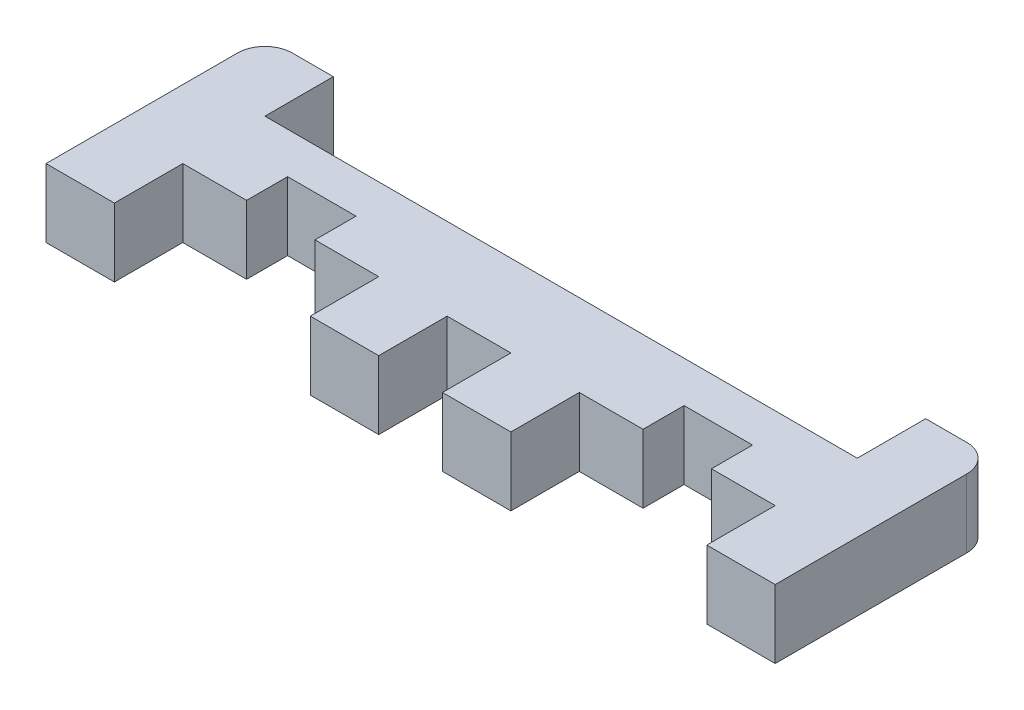
ISO-10303-21;
HEADER;
FILE_DESCRIPTION(('STEP AP214'),'2;1');
FILE_NAME('part.step','',(''),(''),'','','');
FILE_SCHEMA(('AUTOMOTIVE_DESIGN { 1 0 10303 214 1 1 1 1 }'));
ENDSEC;
DATA;
#1=APPLICATION_CONTEXT('core data for automotive mechanical design processes');
#2=APPLICATION_PROTOCOL_DEFINITION('international standard','automotive_design',2000,#1);
#3=PRODUCT_CONTEXT('',#1,'mechanical');
#4=PRODUCT('Part','Part','',(#3));
#5=PRODUCT_RELATED_PRODUCT_CATEGORY('part','',(#4));
#6=PRODUCT_DEFINITION_FORMATION('','',#4);
#7=PRODUCT_DEFINITION_CONTEXT('part definition',#1,'design');
#8=PRODUCT_DEFINITION('design','',#6,#7);
#9=PRODUCT_DEFINITION_SHAPE('','',#8);
#10=(LENGTH_UNIT() NAMED_UNIT(*) SI_UNIT(.MILLI.,.METRE.));
#11=(NAMED_UNIT(*) PLANE_ANGLE_UNIT() SI_UNIT($,.RADIAN.));
#12=(NAMED_UNIT(*) SI_UNIT($,.STERADIAN.) SOLID_ANGLE_UNIT());
#13=UNCERTAINTY_MEASURE_WITH_UNIT(LENGTH_MEASURE(1.E-05),#10,'distance_accuracy_value','');
#14=(GEOMETRIC_REPRESENTATION_CONTEXT(3) GLOBAL_UNCERTAINTY_ASSIGNED_CONTEXT((#13)) GLOBAL_UNIT_ASSIGNED_CONTEXT((#10,
#11,#12)) REPRESENTATION_CONTEXT('',''));
#15=CARTESIAN_POINT('',(0.,0.,0.));
#16=DIRECTION('',(0.,0.,1.));
#17=DIRECTION('',(1.,0.,0.));
#18=AXIS2_PLACEMENT_3D('',#15,#16,#17);
#19=CARTESIAN_POINT('',(-31.3055,6.35,-3.81));
#20=DIRECTION('',(0.,-1.,0.));
#21=DIRECTION('',(0.,0.,-1.));
#22=AXIS2_PLACEMENT_3D('',#19,#20,#21);
#23=CYLINDRICAL_SURFACE('',#22,2.54);
#24=CARTESIAN_POINT('',(-31.3055,0.,-3.81));
#25=DIRECTION('',(0.,1.,0.));
#26=DIRECTION('',(0.,0.,-1.));
#27=AXIS2_PLACEMENT_3D('',#24,#25,#26);
#28=CIRCLE('',#27,2.54);
#29=CARTESIAN_POINT('',(-31.3055,0.,-6.35));
#30=VERTEX_POINT('',#29);
#31=CARTESIAN_POINT('',(-33.8455,0.,-3.80999999999998));
#32=VERTEX_POINT('',#31);
#33=EDGE_CURVE('E264',#30,#32,#28,.T.);
#34=ORIENTED_EDGE('',*,*,#33,.T.);
#35=DIRECTION('',(0.,-1.,0.));
#36=VECTOR('',#35,1.);
#37=CARTESIAN_POINT('',(-33.8455,6.35,-3.80999999999998));
#38=LINE('',#37,#36);
#39=CARTESIAN_POINT('',(-33.8455,6.35,-3.80999999999998));
#40=VERTEX_POINT('',#39);
#41=EDGE_CURVE('E11',#40,#32,#38,.T.);
#42=ORIENTED_EDGE('',*,*,#41,.F.);
#43=CARTESIAN_POINT('',(-31.3055,6.35,-3.81));
#44=DIRECTION('',(0.,1.,0.));
#45=DIRECTION('',(0.,0.,-1.));
#46=AXIS2_PLACEMENT_3D('',#43,#44,#45);
#47=CIRCLE('',#46,2.54);
#48=CARTESIAN_POINT('',(-31.3055,6.35,-6.35));
#49=VERTEX_POINT('',#48);
#50=EDGE_CURVE('E323',#49,#40,#47,.T.);
#51=ORIENTED_EDGE('',*,*,#50,.F.);
#52=DIRECTION('',(0.,-1.,0.));
#53=VECTOR('',#52,1.);
#54=CARTESIAN_POINT('',(-31.3055,6.35,-6.35));
#55=LINE('',#54,#53);
#56=EDGE_CURVE('E260',#49,#30,#55,.T.);
#57=ORIENTED_EDGE('',*,*,#56,.T.);
#58=EDGE_LOOP('',(#34,#42,#51,#57));
#59=FACE_BOUND('',#58,.T.);
#60=ADVANCED_FACE('F37',(#59),#23,.T.);
#61=CARTESIAN_POINT('',(-33.8455,6.35,7.62));
#62=DIRECTION('',(1.,0.,0.));
#63=DIRECTION('',(0.,0.,-1.));
#64=AXIS2_PLACEMENT_3D('',#61,#62,#63);
#65=PLANE('',#64);
#66=DIRECTION('',(0.,0.,1.));
#67=VECTOR('',#66,1.);
#68=CARTESIAN_POINT('',(-33.8455,0.,7.62));
#69=LINE('',#68,#67);
#70=CARTESIAN_POINT('',(-33.8455,0.,13.97));
#71=VERTEX_POINT('',#70);
#72=EDGE_CURVE('E267',#32,#71,#69,.T.);
#73=ORIENTED_EDGE('',*,*,#72,.T.);
#74=DIRECTION('',(0.,-1.,0.));
#75=VECTOR('',#74,1.);
#76=CARTESIAN_POINT('',(-33.8455,6.35,13.97));
#77=LINE('',#76,#75);
#78=CARTESIAN_POINT('',(-33.8455,6.35,13.97));
#79=VERTEX_POINT('',#78);
#80=EDGE_CURVE('E45',#79,#71,#77,.T.);
#81=ORIENTED_EDGE('',*,*,#80,.F.);
#82=DIRECTION('',(0.,0.,1.));
#83=VECTOR('',#82,1.);
#84=CARTESIAN_POINT('',(-33.8455,6.35,7.62));
#85=LINE('',#84,#83);
#86=EDGE_CURVE('E162',#40,#79,#85,.T.);
#87=ORIENTED_EDGE('',*,*,#86,.F.);
#88=ORIENTED_EDGE('',*,*,#41,.T.);
#89=EDGE_LOOP('',(#73,#81,#87,#88));
#90=FACE_BOUND('',#89,.T.);
#91=ADVANCED_FACE('F492',(#90),#65,.F.);
#92=CARTESIAN_POINT('',(-33.8455,6.35,13.97));
#93=DIRECTION('',(0.,0.,-1.));
#94=DIRECTION('',(-1.,0.,0.));
#95=AXIS2_PLACEMENT_3D('',#92,#93,#94);
#96=PLANE('',#95);
#97=DIRECTION('',(1.,0.,0.));
#98=VECTOR('',#97,1.);
#99=CARTESIAN_POINT('',(-33.8455,0.,13.97));
#100=LINE('',#99,#98);
#101=CARTESIAN_POINT('',(-27.4955,0.,13.97));
#102=VERTEX_POINT('',#101);
#103=EDGE_CURVE('E269',#71,#102,#100,.T.);
#104=ORIENTED_EDGE('',*,*,#103,.T.);
#105=DIRECTION('',(0.,-1.,0.));
#106=VECTOR('',#105,1.);
#107=CARTESIAN_POINT('',(-27.4955,6.35,13.97));
#108=LINE('',#107,#106);
#109=CARTESIAN_POINT('',(-27.4955,6.35,13.97));
#110=VERTEX_POINT('',#109);
#111=EDGE_CURVE('E396',#110,#102,#108,.T.);
#112=ORIENTED_EDGE('',*,*,#111,.F.);
#113=DIRECTION('',(1.,0.,0.));
#114=VECTOR('',#113,1.);
#115=CARTESIAN_POINT('',(-33.8455,6.35,13.97));
#116=LINE('',#115,#114);
#117=EDGE_CURVE('E404',#79,#110,#116,.T.);
#118=ORIENTED_EDGE('',*,*,#117,.F.);
#119=ORIENTED_EDGE('',*,*,#80,.T.);
#120=EDGE_LOOP('',(#104,#112,#118,#119));
#121=FACE_BOUND('',#120,.T.);
#122=ADVANCED_FACE('F402',(#121),#96,.F.);
#123=CARTESIAN_POINT('',(-27.4955,6.35,13.97));
#124=DIRECTION('',(-1.,0.,0.));
#125=DIRECTION('',(0.,0.,1.));
#126=AXIS2_PLACEMENT_3D('',#123,#124,#125);
#127=PLANE('',#126);
#128=DIRECTION('',(0.,0.,-1.));
#129=VECTOR('',#128,1.);
#130=CARTESIAN_POINT('',(-27.4955,0.,13.97));
#131=LINE('',#130,#129);
#132=CARTESIAN_POINT('',(-27.4955,0.,7.62));
#133=VERTEX_POINT('',#132);
#134=EDGE_CURVE('E271',#102,#133,#131,.T.);
#135=ORIENTED_EDGE('',*,*,#134,.T.);
#136=DIRECTION('',(0.,-1.,0.));
#137=VECTOR('',#136,1.);
#138=CARTESIAN_POINT('',(-27.4955,6.35,7.62));
#139=LINE('',#138,#137);
#140=CARTESIAN_POINT('',(-27.4955,6.35,7.62));
#141=VERTEX_POINT('',#140);
#142=EDGE_CURVE('E393',#141,#133,#139,.T.);
#143=ORIENTED_EDGE('',*,*,#142,.F.);
#144=DIRECTION('',(0.,0.,-1.));
#145=VECTOR('',#144,1.);
#146=CARTESIAN_POINT('',(-27.4955,6.35,13.97));
#147=LINE('',#146,#145);
#148=EDGE_CURVE('E422',#110,#141,#147,.T.);
#149=ORIENTED_EDGE('',*,*,#148,.F.);
#150=ORIENTED_EDGE('',*,*,#111,.T.);
#151=EDGE_LOOP('',(#135,#143,#149,#150));
#152=FACE_BOUND('',#151,.T.);
#153=ADVANCED_FACE('F413',(#152),#127,.F.);
#154=CARTESIAN_POINT('',(-27.4955,6.35,7.62));
#155=DIRECTION('',(0.,0.,-1.));
#156=DIRECTION('',(-1.,0.,0.));
#157=AXIS2_PLACEMENT_3D('',#154,#155,#156);
#158=PLANE('',#157);
#159=DIRECTION('',(1.,0.,0.));
#160=VECTOR('',#159,1.);
#161=CARTESIAN_POINT('',(-27.4955,0.,7.62));
#162=LINE('',#161,#160);
#163=CARTESIAN_POINT('',(-21.5773,0.,7.62));
#164=VERTEX_POINT('',#163);
#165=EDGE_CURVE('E273',#133,#164,#162,.T.);
#166=ORIENTED_EDGE('',*,*,#165,.T.);
#167=DIRECTION('',(0.,-1.,0.));
#168=VECTOR('',#167,1.);
#169=CARTESIAN_POINT('',(-21.5773,6.35,7.62));
#170=LINE('',#169,#168);
#171=CARTESIAN_POINT('',(-21.5773,6.35,7.62));
#172=VERTEX_POINT('',#171);
#173=EDGE_CURVE('E390',#172,#164,#170,.T.);
#174=ORIENTED_EDGE('',*,*,#173,.F.);
#175=DIRECTION('',(1.,0.,0.));
#176=VECTOR('',#175,1.);
#177=CARTESIAN_POINT('',(-27.4955,6.35,7.62));
#178=LINE('',#177,#176);
#179=EDGE_CURVE('E419',#141,#172,#178,.T.);
#180=ORIENTED_EDGE('',*,*,#179,.F.);
#181=ORIENTED_EDGE('',*,*,#142,.T.);
#182=EDGE_LOOP('',(#166,#174,#180,#181));
#183=FACE_BOUND('',#182,.T.);
#184=ADVANCED_FACE('F417',(#183),#158,.F.);
#185=CARTESIAN_POINT('',(-21.5773,6.35,3.81000000000002));
#186=DIRECTION('',(-1.,0.,0.));
#187=DIRECTION('',(0.,0.,1.));
#188=AXIS2_PLACEMENT_3D('',#185,#186,#187);
#189=PLANE('',#188);
#190=DIRECTION('',(0.,0.,-1.));
#191=VECTOR('',#190,1.);
#192=CARTESIAN_POINT('',(-21.5773,0.,3.81000000000002));
#193=LINE('',#192,#191);
#194=CARTESIAN_POINT('',(-21.5773,0.,3.81000000000002));
#195=VERTEX_POINT('',#194);
#196=EDGE_CURVE('E275',#164,#195,#193,.T.);
#197=ORIENTED_EDGE('',*,*,#196,.T.);
#198=DIRECTION('',(0.,-1.,0.));
#199=VECTOR('',#198,1.);
#200=CARTESIAN_POINT('',(-21.5773,6.35,3.81000000000002));
#201=LINE('',#200,#199);
#202=CARTESIAN_POINT('',(-21.5773,6.35,3.81000000000002));
#203=VERTEX_POINT('',#202);
#204=EDGE_CURVE('E387',#203,#195,#201,.T.);
#205=ORIENTED_EDGE('',*,*,#204,.F.);
#206=DIRECTION('',(0.,0.,-1.));
#207=VECTOR('',#206,1.);
#208=CARTESIAN_POINT('',(-21.5773,6.35,3.81000000000002));
#209=LINE('',#208,#207);
#210=EDGE_CURVE('E421',#172,#203,#209,.T.);
#211=ORIENTED_EDGE('',*,*,#210,.F.);
#212=ORIENTED_EDGE('',*,*,#173,.T.);
#213=EDGE_LOOP('',(#197,#205,#211,#212));
#214=FACE_BOUND('',#213,.T.);
#215=ADVANCED_FACE('F505',(#214),#189,.F.);
#216=CARTESIAN_POINT('',(-15.2273,6.35,3.81000000000002));
#217=DIRECTION('',(0.,0.,-1.));
#218=DIRECTION('',(-1.,0.,0.));
#219=AXIS2_PLACEMENT_3D('',#216,#217,#218);
#220=PLANE('',#219);
#221=DIRECTION('',(1.,0.,0.));
#222=VECTOR('',#221,1.);
#223=CARTESIAN_POINT('',(-15.2273,0.,3.81000000000002));
#224=LINE('',#223,#222);
#225=CARTESIAN_POINT('',(-15.2273,0.,3.81000000000002));
#226=VERTEX_POINT('',#225);
#227=EDGE_CURVE('E277',#195,#226,#224,.T.);
#228=ORIENTED_EDGE('',*,*,#227,.T.);
#229=DIRECTION('',(0.,-1.,0.));
#230=VECTOR('',#229,1.);
#231=CARTESIAN_POINT('',(-15.2273,6.35,3.81000000000002));
#232=LINE('',#231,#230);
#233=CARTESIAN_POINT('',(-15.2273,6.35,3.81000000000002));
#234=VERTEX_POINT('',#233);
#235=EDGE_CURVE('E384',#234,#226,#232,.T.);
#236=ORIENTED_EDGE('',*,*,#235,.F.);
#237=DIRECTION('',(1.,0.,0.));
#238=VECTOR('',#237,1.);
#239=CARTESIAN_POINT('',(-15.2273,6.35,3.81000000000002));
#240=LINE('',#239,#238);
#241=EDGE_CURVE('E424',#203,#234,#240,.T.);
#242=ORIENTED_EDGE('',*,*,#241,.F.);
#243=ORIENTED_EDGE('',*,*,#204,.T.);
#244=EDGE_LOOP('',(#228,#236,#242,#243));
#245=FACE_BOUND('',#244,.T.);
#246=ADVANCED_FACE('F508',(#245),#220,.F.);
#247=CARTESIAN_POINT('',(-15.2273,6.35,3.81000000000002));
#248=DIRECTION('',(1.,0.,0.));
#249=DIRECTION('',(0.,0.,-1.));
#250=AXIS2_PLACEMENT_3D('',#247,#248,#249);
#251=PLANE('',#250);
#252=DIRECTION('',(0.,0.,1.));
#253=VECTOR('',#252,1.);
#254=CARTESIAN_POINT('',(-15.2273,0.,3.81000000000002));
#255=LINE('',#254,#253);
#256=CARTESIAN_POINT('',(-15.2273,0.,7.62));
#257=VERTEX_POINT('',#256);
#258=EDGE_CURVE('E279',#226,#257,#255,.T.);
#259=ORIENTED_EDGE('',*,*,#258,.T.);
#260=DIRECTION('',(0.,-1.,0.));
#261=VECTOR('',#260,1.);
#262=CARTESIAN_POINT('',(-15.2273,6.35,7.62));
#263=LINE('',#262,#261);
#264=CARTESIAN_POINT('',(-15.2273,6.35,7.62));
#265=VERTEX_POINT('',#264);
#266=EDGE_CURVE('E381',#265,#257,#263,.T.);
#267=ORIENTED_EDGE('',*,*,#266,.F.);
#268=DIRECTION('',(0.,0.,1.));
#269=VECTOR('',#268,1.);
#270=CARTESIAN_POINT('',(-15.2273,6.35,3.81000000000002));
#271=LINE('',#270,#269);
#272=EDGE_CURVE('E430',#234,#265,#271,.T.);
#273=ORIENTED_EDGE('',*,*,#272,.F.);
#274=ORIENTED_EDGE('',*,*,#235,.T.);
#275=EDGE_LOOP('',(#259,#267,#273,#274));
#276=FACE_BOUND('',#275,.T.);
#277=ADVANCED_FACE('F512',(#276),#251,.F.);
#278=CARTESIAN_POINT('',(-15.2273,6.35,7.62));
#279=DIRECTION('',(0.,0.,-1.));
#280=DIRECTION('',(-1.,0.,0.));
#281=AXIS2_PLACEMENT_3D('',#278,#279,#280);
#282=PLANE('',#281);
#283=DIRECTION('',(1.,0.,0.));
#284=VECTOR('',#283,1.);
#285=CARTESIAN_POINT('',(-15.2273,0.,7.62));
#286=LINE('',#285,#284);
#287=CARTESIAN_POINT('',(-9.3091,0.,7.62));
#288=VERTEX_POINT('',#287);
#289=EDGE_CURVE('E281',#257,#288,#286,.T.);
#290=ORIENTED_EDGE('',*,*,#289,.T.);
#291=DIRECTION('',(0.,-1.,0.));
#292=VECTOR('',#291,1.);
#293=CARTESIAN_POINT('',(-9.3091,6.35,7.62));
#294=LINE('',#293,#292);
#295=CARTESIAN_POINT('',(-9.3091,6.35,7.62));
#296=VERTEX_POINT('',#295);
#297=EDGE_CURVE('E378',#296,#288,#294,.T.);
#298=ORIENTED_EDGE('',*,*,#297,.F.);
#299=DIRECTION('',(1.,0.,0.));
#300=VECTOR('',#299,1.);
#301=CARTESIAN_POINT('',(-15.2273,6.35,7.62));
#302=LINE('',#301,#300);
#303=EDGE_CURVE('E432',#265,#296,#302,.T.);
#304=ORIENTED_EDGE('',*,*,#303,.F.);
#305=ORIENTED_EDGE('',*,*,#266,.T.);
#306=EDGE_LOOP('',(#290,#298,#304,#305));
#307=FACE_BOUND('',#306,.T.);
#308=ADVANCED_FACE('F516',(#307),#282,.F.);
#309=CARTESIAN_POINT('',(-9.3091,6.35,7.62));
#310=DIRECTION('',(1.,0.,0.));
#311=DIRECTION('',(0.,0.,-1.));
#312=AXIS2_PLACEMENT_3D('',#309,#310,#311);
#313=PLANE('',#312);
#314=DIRECTION('',(0.,0.,1.));
#315=VECTOR('',#314,1.);
#316=CARTESIAN_POINT('',(-9.3091,0.,7.62));
#317=LINE('',#316,#315);
#318=CARTESIAN_POINT('',(-9.3091,0.,13.97));
#319=VERTEX_POINT('',#318);
#320=EDGE_CURVE('E283',#288,#319,#317,.T.);
#321=ORIENTED_EDGE('',*,*,#320,.T.);
#322=DIRECTION('',(0.,-1.,0.));
#323=VECTOR('',#322,1.);
#324=CARTESIAN_POINT('',(-9.3091,6.35,13.97));
#325=LINE('',#324,#323);
#326=CARTESIAN_POINT('',(-9.3091,6.35,13.97));
#327=VERTEX_POINT('',#326);
#328=EDGE_CURVE('E375',#327,#319,#325,.T.);
#329=ORIENTED_EDGE('',*,*,#328,.F.);
#330=DIRECTION('',(0.,0.,1.));
#331=VECTOR('',#330,1.);
#332=CARTESIAN_POINT('',(-9.3091,6.35,7.62));
#333=LINE('',#332,#331);
#334=EDGE_CURVE('E434',#296,#327,#333,.T.);
#335=ORIENTED_EDGE('',*,*,#334,.F.);
#336=ORIENTED_EDGE('',*,*,#297,.T.);
#337=EDGE_LOOP('',(#321,#329,#335,#336));
#338=FACE_BOUND('',#337,.T.);
#339=ADVANCED_FACE('F520',(#338),#313,.F.);
#340=CARTESIAN_POINT('',(-9.3091,6.35,13.97));
#341=DIRECTION('',(0.,0.,-1.));
#342=DIRECTION('',(-1.,0.,0.));
#343=AXIS2_PLACEMENT_3D('',#340,#341,#342);
#344=PLANE('',#343);
#345=DIRECTION('',(1.,0.,0.));
#346=VECTOR('',#345,1.);
#347=CARTESIAN_POINT('',(-9.3091,0.,13.97));
#348=LINE('',#347,#346);
#349=CARTESIAN_POINT('',(-2.9591,0.,13.97));
#350=VERTEX_POINT('',#349);
#351=EDGE_CURVE('E285',#319,#350,#348,.T.);
#352=ORIENTED_EDGE('',*,*,#351,.T.);
#353=DIRECTION('',(0.,-1.,0.));
#354=VECTOR('',#353,1.);
#355=CARTESIAN_POINT('',(-2.9591,6.35,13.97));
#356=LINE('',#355,#354);
#357=CARTESIAN_POINT('',(-2.9591,6.35,13.97));
#358=VERTEX_POINT('',#357);
#359=EDGE_CURVE('E372',#358,#350,#356,.T.);
#360=ORIENTED_EDGE('',*,*,#359,.F.);
#361=DIRECTION('',(1.,0.,0.));
#362=VECTOR('',#361,1.);
#363=CARTESIAN_POINT('',(-9.3091,6.35,13.97));
#364=LINE('',#363,#362);
#365=EDGE_CURVE('E436',#327,#358,#364,.T.);
#366=ORIENTED_EDGE('',*,*,#365,.F.);
#367=ORIENTED_EDGE('',*,*,#328,.T.);
#368=EDGE_LOOP('',(#352,#360,#366,#367));
#369=FACE_BOUND('',#368,.T.);
#370=ADVANCED_FACE('F524',(#369),#344,.F.);
#371=CARTESIAN_POINT('',(-2.9591,6.35,13.97));
#372=DIRECTION('',(-1.,0.,0.));
#373=DIRECTION('',(0.,0.,1.));
#374=AXIS2_PLACEMENT_3D('',#371,#372,#373);
#375=PLANE('',#374);
#376=DIRECTION('',(0.,0.,-1.));
#377=VECTOR('',#376,1.);
#378=CARTESIAN_POINT('',(-2.9591,0.,13.97));
#379=LINE('',#378,#377);
#380=CARTESIAN_POINT('',(-2.9591,0.,7.62));
#381=VERTEX_POINT('',#380);
#382=EDGE_CURVE('E287',#350,#381,#379,.T.);
#383=ORIENTED_EDGE('',*,*,#382,.T.);
#384=DIRECTION('',(0.,-1.,0.));
#385=VECTOR('',#384,1.);
#386=CARTESIAN_POINT('',(-2.9591,6.35,7.62));
#387=LINE('',#386,#385);
#388=CARTESIAN_POINT('',(-2.9591,6.35,7.62));
#389=VERTEX_POINT('',#388);
#390=EDGE_CURVE('E369',#389,#381,#387,.T.);
#391=ORIENTED_EDGE('',*,*,#390,.F.);
#392=DIRECTION('',(0.,0.,-1.));
#393=VECTOR('',#392,1.);
#394=CARTESIAN_POINT('',(-2.9591,6.35,13.97));
#395=LINE('',#394,#393);
#396=EDGE_CURVE('E438',#358,#389,#395,.T.);
#397=ORIENTED_EDGE('',*,*,#396,.F.);
#398=ORIENTED_EDGE('',*,*,#359,.T.);
#399=EDGE_LOOP('',(#383,#391,#397,#398));
#400=FACE_BOUND('',#399,.T.);
#401=ADVANCED_FACE('F528',(#400),#375,.F.);
#402=CARTESIAN_POINT('',(-2.9591,6.35,7.62));
#403=DIRECTION('',(0.,0.,-1.));
#404=DIRECTION('',(-1.,0.,0.));
#405=AXIS2_PLACEMENT_3D('',#402,#403,#404);
#406=PLANE('',#405);
#407=DIRECTION('',(1.,0.,0.));
#408=VECTOR('',#407,1.);
#409=CARTESIAN_POINT('',(-2.9591,0.,7.62));
#410=LINE('',#409,#408);
#411=CARTESIAN_POINT('',(2.9591,0.,7.62));
#412=VERTEX_POINT('',#411);
#413=EDGE_CURVE('E289',#381,#412,#410,.T.);
#414=ORIENTED_EDGE('',*,*,#413,.T.);
#415=DIRECTION('',(0.,-1.,0.));
#416=VECTOR('',#415,1.);
#417=CARTESIAN_POINT('',(2.9591,6.35,7.62));
#418=LINE('',#417,#416);
#419=CARTESIAN_POINT('',(2.9591,6.35,7.62));
#420=VERTEX_POINT('',#419);
#421=EDGE_CURVE('E366',#420,#412,#418,.T.);
#422=ORIENTED_EDGE('',*,*,#421,.F.);
#423=DIRECTION('',(1.,0.,0.));
#424=VECTOR('',#423,1.);
#425=CARTESIAN_POINT('',(-2.9591,6.35,7.62));
#426=LINE('',#425,#424);
#427=EDGE_CURVE('E440',#389,#420,#426,.T.);
#428=ORIENTED_EDGE('',*,*,#427,.F.);
#429=ORIENTED_EDGE('',*,*,#390,.T.);
#430=EDGE_LOOP('',(#414,#422,#428,#429));
#431=FACE_BOUND('',#430,.T.);
#432=ADVANCED_FACE('F532',(#431),#406,.F.);
#433=CARTESIAN_POINT('',(2.9591,6.35,7.62));
#434=DIRECTION('',(1.,0.,0.));
#435=DIRECTION('',(0.,0.,-1.));
#436=AXIS2_PLACEMENT_3D('',#433,#434,#435);
#437=PLANE('',#436);
#438=DIRECTION('',(0.,0.,1.));
#439=VECTOR('',#438,1.);
#440=CARTESIAN_POINT('',(2.9591,0.,7.62));
#441=LINE('',#440,#439);
#442=CARTESIAN_POINT('',(2.9591,0.,13.97));
#443=VERTEX_POINT('',#442);
#444=EDGE_CURVE('E291',#412,#443,#441,.T.);
#445=ORIENTED_EDGE('',*,*,#444,.T.);
#446=DIRECTION('',(0.,-1.,0.));
#447=VECTOR('',#446,1.);
#448=CARTESIAN_POINT('',(2.9591,6.35,13.97));
#449=LINE('',#448,#447);
#450=CARTESIAN_POINT('',(2.9591,6.35,13.97));
#451=VERTEX_POINT('',#450);
#452=EDGE_CURVE('E363',#451,#443,#449,.T.);
#453=ORIENTED_EDGE('',*,*,#452,.F.);
#454=DIRECTION('',(0.,0.,1.));
#455=VECTOR('',#454,1.);
#456=CARTESIAN_POINT('',(2.9591,6.35,7.62));
#457=LINE('',#456,#455);
#458=EDGE_CURVE('E442',#420,#451,#457,.T.);
#459=ORIENTED_EDGE('',*,*,#458,.F.);
#460=ORIENTED_EDGE('',*,*,#421,.T.);
#461=EDGE_LOOP('',(#445,#453,#459,#460));
#462=FACE_BOUND('',#461,.T.);
#463=ADVANCED_FACE('F536',(#462),#437,.F.);
#464=CARTESIAN_POINT('',(2.9591,6.35,13.97));
#465=DIRECTION('',(0.,0.,-1.));
#466=DIRECTION('',(-1.,0.,0.));
#467=AXIS2_PLACEMENT_3D('',#464,#465,#466);
#468=PLANE('',#467);
#469=DIRECTION('',(1.,0.,0.));
#470=VECTOR('',#469,1.);
#471=CARTESIAN_POINT('',(2.9591,0.,13.97));
#472=LINE('',#471,#470);
#473=CARTESIAN_POINT('',(9.3091,0.,13.97));
#474=VERTEX_POINT('',#473);
#475=EDGE_CURVE('E293',#443,#474,#472,.T.);
#476=ORIENTED_EDGE('',*,*,#475,.T.);
#477=DIRECTION('',(0.,-1.,0.));
#478=VECTOR('',#477,1.);
#479=CARTESIAN_POINT('',(9.3091,6.35,13.97));
#480=LINE('',#479,#478);
#481=CARTESIAN_POINT('',(9.3091,6.35,13.97));
#482=VERTEX_POINT('',#481);
#483=EDGE_CURVE('E360',#482,#474,#480,.T.);
#484=ORIENTED_EDGE('',*,*,#483,.F.);
#485=DIRECTION('',(1.,0.,0.));
#486=VECTOR('',#485,1.);
#487=CARTESIAN_POINT('',(2.9591,6.35,13.97));
#488=LINE('',#487,#486);
#489=EDGE_CURVE('E444',#451,#482,#488,.T.);
#490=ORIENTED_EDGE('',*,*,#489,.F.);
#491=ORIENTED_EDGE('',*,*,#452,.T.);
#492=EDGE_LOOP('',(#476,#484,#490,#491));
#493=FACE_BOUND('',#492,.T.);
#494=ADVANCED_FACE('F540',(#493),#468,.F.);
#495=CARTESIAN_POINT('',(9.3091,6.35,13.97));
#496=DIRECTION('',(-1.,0.,0.));
#497=DIRECTION('',(0.,0.,1.));
#498=AXIS2_PLACEMENT_3D('',#495,#496,#497);
#499=PLANE('',#498);
#500=DIRECTION('',(0.,0.,-1.));
#501=VECTOR('',#500,1.);
#502=CARTESIAN_POINT('',(9.3091,0.,13.97));
#503=LINE('',#502,#501);
#504=CARTESIAN_POINT('',(9.3091,0.,7.62));
#505=VERTEX_POINT('',#504);
#506=EDGE_CURVE('E295',#474,#505,#503,.T.);
#507=ORIENTED_EDGE('',*,*,#506,.T.);
#508=DIRECTION('',(0.,-1.,0.));
#509=VECTOR('',#508,1.);
#510=CARTESIAN_POINT('',(9.3091,6.35,7.62));
#511=LINE('',#510,#509);
#512=CARTESIAN_POINT('',(9.3091,6.35,7.62));
#513=VERTEX_POINT('',#512);
#514=EDGE_CURVE('E357',#513,#505,#511,.T.);
#515=ORIENTED_EDGE('',*,*,#514,.F.);
#516=DIRECTION('',(0.,0.,-1.));
#517=VECTOR('',#516,1.);
#518=CARTESIAN_POINT('',(9.3091,6.35,13.97));
#519=LINE('',#518,#517);
#520=EDGE_CURVE('E446',#482,#513,#519,.T.);
#521=ORIENTED_EDGE('',*,*,#520,.F.);
#522=ORIENTED_EDGE('',*,*,#483,.T.);
#523=EDGE_LOOP('',(#507,#515,#521,#522));
#524=FACE_BOUND('',#523,.T.);
#525=ADVANCED_FACE('F544',(#524),#499,.F.);
#526=CARTESIAN_POINT('',(15.2273,6.35,7.61999999999999));
#527=DIRECTION('',(0.,0.,-1.));
#528=DIRECTION('',(-1.,0.,0.));
#529=AXIS2_PLACEMENT_3D('',#526,#527,#528);
#530=PLANE('',#529);
#531=DIRECTION('',(1.,0.,0.));
#532=VECTOR('',#531,1.);
#533=CARTESIAN_POINT('',(15.2273,0.,7.61999999999999));
#534=LINE('',#533,#532);
#535=CARTESIAN_POINT('',(15.2273,0.,7.61999999999999));
#536=VERTEX_POINT('',#535);
#537=EDGE_CURVE('E297',#505,#536,#534,.T.);
#538=ORIENTED_EDGE('',*,*,#537,.T.);
#539=DIRECTION('',(0.,-1.,0.));
#540=VECTOR('',#539,1.);
#541=CARTESIAN_POINT('',(15.2273,6.35,7.61999999999999));
#542=LINE('',#541,#540);
#543=CARTESIAN_POINT('',(15.2273,6.35,7.61999999999999));
#544=VERTEX_POINT('',#543);
#545=EDGE_CURVE('E354',#544,#536,#542,.T.);
#546=ORIENTED_EDGE('',*,*,#545,.F.);
#547=DIRECTION('',(1.,0.,0.));
#548=VECTOR('',#547,1.);
#549=CARTESIAN_POINT('',(15.2273,6.35,7.61999999999999));
#550=LINE('',#549,#548);
#551=EDGE_CURVE('E448',#513,#544,#550,.T.);
#552=ORIENTED_EDGE('',*,*,#551,.F.);
#553=ORIENTED_EDGE('',*,*,#514,.T.);
#554=EDGE_LOOP('',(#538,#546,#552,#553));
#555=FACE_BOUND('',#554,.T.);
#556=ADVANCED_FACE('F548',(#555),#530,.F.);
#557=CARTESIAN_POINT('',(15.2273,6.35,3.81000000000002));
#558=DIRECTION('',(-1.,0.,0.));
#559=DIRECTION('',(0.,0.,1.));
#560=AXIS2_PLACEMENT_3D('',#557,#558,#559);
#561=PLANE('',#560);
#562=DIRECTION('',(0.,0.,-1.));
#563=VECTOR('',#562,1.);
#564=CARTESIAN_POINT('',(15.2273,0.,3.81000000000002));
#565=LINE('',#564,#563);
#566=CARTESIAN_POINT('',(15.2273,0.,3.81000000000002));
#567=VERTEX_POINT('',#566);
#568=EDGE_CURVE('E299',#536,#567,#565,.T.);
#569=ORIENTED_EDGE('',*,*,#568,.T.);
#570=DIRECTION('',(0.,-1.,0.));
#571=VECTOR('',#570,1.);
#572=CARTESIAN_POINT('',(15.2273,6.35,3.81000000000002));
#573=LINE('',#572,#571);
#574=CARTESIAN_POINT('',(15.2273,6.35,3.81000000000002));
#575=VERTEX_POINT('',#574);
#576=EDGE_CURVE('E351',#575,#567,#573,.T.);
#577=ORIENTED_EDGE('',*,*,#576,.F.);
#578=DIRECTION('',(0.,0.,-1.));
#579=VECTOR('',#578,1.);
#580=CARTESIAN_POINT('',(15.2273,6.35,3.81000000000002));
#581=LINE('',#580,#579);
#582=EDGE_CURVE('E450',#544,#575,#581,.T.);
#583=ORIENTED_EDGE('',*,*,#582,.F.);
#584=ORIENTED_EDGE('',*,*,#545,.T.);
#585=EDGE_LOOP('',(#569,#577,#583,#584));
#586=FACE_BOUND('',#585,.T.);
#587=ADVANCED_FACE('F552',(#586),#561,.F.);
#588=CARTESIAN_POINT('',(15.2273,6.35,3.81000000000002));
#589=DIRECTION('',(0.,0.,-1.));
#590=DIRECTION('',(-1.,0.,0.));
#591=AXIS2_PLACEMENT_3D('',#588,#589,#590);
#592=PLANE('',#591);
#593=DIRECTION('',(1.,0.,0.));
#594=VECTOR('',#593,1.);
#595=CARTESIAN_POINT('',(15.2273,0.,3.81000000000002));
#596=LINE('',#595,#594);
#597=CARTESIAN_POINT('',(21.5773,0.,3.81000000000002));
#598=VERTEX_POINT('',#597);
#599=EDGE_CURVE('E301',#567,#598,#596,.T.);
#600=ORIENTED_EDGE('',*,*,#599,.T.);
#601=DIRECTION('',(0.,-1.,0.));
#602=VECTOR('',#601,1.);
#603=CARTESIAN_POINT('',(21.5773,6.35,3.81000000000002));
#604=LINE('',#603,#602);
#605=CARTESIAN_POINT('',(21.5773,6.35,3.81000000000002));
#606=VERTEX_POINT('',#605);
#607=EDGE_CURVE('E348',#606,#598,#604,.T.);
#608=ORIENTED_EDGE('',*,*,#607,.F.);
#609=DIRECTION('',(1.,0.,0.));
#610=VECTOR('',#609,1.);
#611=CARTESIAN_POINT('',(15.2273,6.35,3.81000000000002));
#612=LINE('',#611,#610);
#613=EDGE_CURVE('E452',#575,#606,#612,.T.);
#614=ORIENTED_EDGE('',*,*,#613,.F.);
#615=ORIENTED_EDGE('',*,*,#576,.T.);
#616=EDGE_LOOP('',(#600,#608,#614,#615));
#617=FACE_BOUND('',#616,.T.);
#618=ADVANCED_FACE('F556',(#617),#592,.F.);
#619=CARTESIAN_POINT('',(21.5773,6.35,3.81000000000002));
#620=DIRECTION('',(1.,0.,0.));
#621=DIRECTION('',(0.,0.,-1.));
#622=AXIS2_PLACEMENT_3D('',#619,#620,#621);
#623=PLANE('',#622);
#624=DIRECTION('',(0.,0.,1.));
#625=VECTOR('',#624,1.);
#626=CARTESIAN_POINT('',(21.5773,0.,3.81000000000002));
#627=LINE('',#626,#625);
#628=CARTESIAN_POINT('',(21.5773,0.,7.61999999999999));
#629=VERTEX_POINT('',#628);
#630=EDGE_CURVE('E303',#598,#629,#627,.T.);
#631=ORIENTED_EDGE('',*,*,#630,.T.);
#632=DIRECTION('',(0.,-1.,0.));
#633=VECTOR('',#632,1.);
#634=CARTESIAN_POINT('',(21.5773,6.35,7.61999999999999));
#635=LINE('',#634,#633);
#636=CARTESIAN_POINT('',(21.5773,6.35,7.61999999999999));
#637=VERTEX_POINT('',#636);
#638=EDGE_CURVE('E345',#637,#629,#635,.T.);
#639=ORIENTED_EDGE('',*,*,#638,.F.);
#640=DIRECTION('',(0.,0.,1.));
#641=VECTOR('',#640,1.);
#642=CARTESIAN_POINT('',(21.5773,6.35,3.81000000000002));
#643=LINE('',#642,#641);
#644=EDGE_CURVE('E454',#606,#637,#643,.T.);
#645=ORIENTED_EDGE('',*,*,#644,.F.);
#646=ORIENTED_EDGE('',*,*,#607,.T.);
#647=EDGE_LOOP('',(#631,#639,#645,#646));
#648=FACE_BOUND('',#647,.T.);
#649=ADVANCED_FACE('F560',(#648),#623,.F.);
#650=CARTESIAN_POINT('',(27.4955,6.35,7.61999999999999));
#651=DIRECTION('',(0.,0.,-1.));
#652=DIRECTION('',(-1.,0.,0.));
#653=AXIS2_PLACEMENT_3D('',#650,#651,#652);
#654=PLANE('',#653);
#655=DIRECTION('',(1.,0.,0.));
#656=VECTOR('',#655,1.);
#657=CARTESIAN_POINT('',(27.4955,0.,7.61999999999999));
#658=LINE('',#657,#656);
#659=CARTESIAN_POINT('',(27.4955,0.,7.61999999999999));
#660=VERTEX_POINT('',#659);
#661=EDGE_CURVE('E305',#629,#660,#658,.T.);
#662=ORIENTED_EDGE('',*,*,#661,.T.);
#663=DIRECTION('',(0.,-1.,0.));
#664=VECTOR('',#663,1.);
#665=CARTESIAN_POINT('',(27.4955,6.35,7.61999999999999));
#666=LINE('',#665,#664);
#667=CARTESIAN_POINT('',(27.4955,6.35,7.61999999999999));
#668=VERTEX_POINT('',#667);
#669=EDGE_CURVE('E342',#668,#660,#666,.T.);
#670=ORIENTED_EDGE('',*,*,#669,.F.);
#671=DIRECTION('',(1.,0.,0.));
#672=VECTOR('',#671,1.);
#673=CARTESIAN_POINT('',(27.4955,6.35,7.61999999999999));
#674=LINE('',#673,#672);
#675=EDGE_CURVE('E456',#637,#668,#674,.T.);
#676=ORIENTED_EDGE('',*,*,#675,.F.);
#677=ORIENTED_EDGE('',*,*,#638,.T.);
#678=EDGE_LOOP('',(#662,#670,#676,#677));
#679=FACE_BOUND('',#678,.T.);
#680=ADVANCED_FACE('F564',(#679),#654,.F.);
#681=CARTESIAN_POINT('',(27.4955,6.35,7.61999999999999));
#682=DIRECTION('',(1.,0.,0.));
#683=DIRECTION('',(0.,0.,-1.));
#684=AXIS2_PLACEMENT_3D('',#681,#682,#683);
#685=PLANE('',#684);
#686=DIRECTION('',(0.,0.,1.));
#687=VECTOR('',#686,1.);
#688=CARTESIAN_POINT('',(27.4955,0.,7.61999999999999));
#689=LINE('',#688,#687);
#690=CARTESIAN_POINT('',(27.4955,0.,13.97));
#691=VERTEX_POINT('',#690);
#692=EDGE_CURVE('E307',#660,#691,#689,.T.);
#693=ORIENTED_EDGE('',*,*,#692,.T.);
#694=DIRECTION('',(0.,-1.,0.));
#695=VECTOR('',#694,1.);
#696=CARTESIAN_POINT('',(27.4955,6.35,13.97));
#697=LINE('',#696,#695);
#698=CARTESIAN_POINT('',(27.4955,6.35,13.97));
#699=VERTEX_POINT('',#698);
#700=EDGE_CURVE('E339',#699,#691,#697,.T.);
#701=ORIENTED_EDGE('',*,*,#700,.F.);
#702=DIRECTION('',(0.,0.,1.));
#703=VECTOR('',#702,1.);
#704=CARTESIAN_POINT('',(27.4955,6.35,7.61999999999999));
#705=LINE('',#704,#703);
#706=EDGE_CURVE('E458',#668,#699,#705,.T.);
#707=ORIENTED_EDGE('',*,*,#706,.F.);
#708=ORIENTED_EDGE('',*,*,#669,.T.);
#709=EDGE_LOOP('',(#693,#701,#707,#708));
#710=FACE_BOUND('',#709,.T.);
#711=ADVANCED_FACE('F568',(#710),#685,.F.);
#712=CARTESIAN_POINT('',(27.4955,6.35,13.97));
#713=DIRECTION('',(0.,0.,-1.));
#714=DIRECTION('',(-1.,0.,0.));
#715=AXIS2_PLACEMENT_3D('',#712,#713,#714);
#716=PLANE('',#715);
#717=DIRECTION('',(1.,0.,0.));
#718=VECTOR('',#717,1.);
#719=CARTESIAN_POINT('',(27.4955,0.,13.97));
#720=LINE('',#719,#718);
#721=CARTESIAN_POINT('',(33.8455,0.,13.97));
#722=VERTEX_POINT('',#721);
#723=EDGE_CURVE('E309',#691,#722,#720,.T.);
#724=ORIENTED_EDGE('',*,*,#723,.T.);
#725=DIRECTION('',(0.,-1.,0.));
#726=VECTOR('',#725,1.);
#727=CARTESIAN_POINT('',(33.8455,6.35,13.97));
#728=LINE('',#727,#726);
#729=CARTESIAN_POINT('',(33.8455,6.35,13.97));
#730=VERTEX_POINT('',#729);
#731=EDGE_CURVE('E336',#730,#722,#728,.T.);
#732=ORIENTED_EDGE('',*,*,#731,.F.);
#733=DIRECTION('',(1.,0.,0.));
#734=VECTOR('',#733,1.);
#735=CARTESIAN_POINT('',(27.4955,6.35,13.97));
#736=LINE('',#735,#734);
#737=EDGE_CURVE('E460',#699,#730,#736,.T.);
#738=ORIENTED_EDGE('',*,*,#737,.F.);
#739=ORIENTED_EDGE('',*,*,#700,.T.);
#740=EDGE_LOOP('',(#724,#732,#738,#739));
#741=FACE_BOUND('',#740,.T.);
#742=ADVANCED_FACE('F572',(#741),#716,.F.);
#743=CARTESIAN_POINT('',(33.8455,6.35,13.97));
#744=DIRECTION('',(-1.,0.,0.));
#745=DIRECTION('',(0.,0.,1.));
#746=AXIS2_PLACEMENT_3D('',#743,#744,#745);
#747=PLANE('',#746);
#748=DIRECTION('',(0.,0.,-1.));
#749=VECTOR('',#748,1.);
#750=CARTESIAN_POINT('',(33.8455,0.,13.97));
#751=LINE('',#750,#749);
#752=CARTESIAN_POINT('',(33.8455,0.,-3.80999999999998));
#753=VERTEX_POINT('',#752);
#754=EDGE_CURVE('E311',#722,#753,#751,.T.);
#755=ORIENTED_EDGE('',*,*,#754,.T.);
#756=DIRECTION('',(0.,-1.,0.));
#757=VECTOR('',#756,1.);
#758=CARTESIAN_POINT('',(33.8455,6.35,-3.80999999999998));
#759=LINE('',#758,#757);
#760=CARTESIAN_POINT('',(33.8455,6.35,-3.80999999999998));
#761=VERTEX_POINT('',#760);
#762=EDGE_CURVE('E333',#761,#753,#759,.T.);
#763=ORIENTED_EDGE('',*,*,#762,.F.);
#764=DIRECTION('',(0.,0.,-1.));
#765=VECTOR('',#764,1.);
#766=CARTESIAN_POINT('',(33.8455,6.35,13.97));
#767=LINE('',#766,#765);
#768=EDGE_CURVE('E462',#730,#761,#767,.T.);
#769=ORIENTED_EDGE('',*,*,#768,.F.);
#770=ORIENTED_EDGE('',*,*,#731,.T.);
#771=EDGE_LOOP('',(#755,#763,#769,#770));
#772=FACE_BOUND('',#771,.T.);
#773=ADVANCED_FACE('F576',(#772),#747,.F.);
#774=CARTESIAN_POINT('',(31.3055,6.35,-3.81));
#775=DIRECTION('',(0.,-1.,0.));
#776=DIRECTION('',(0.,0.,-1.));
#777=AXIS2_PLACEMENT_3D('',#774,#775,#776);
#778=CYLINDRICAL_SURFACE('',#777,2.54);
#779=CARTESIAN_POINT('',(31.3055,0.,-3.81));
#780=DIRECTION('',(0.,1.,0.));
#781=DIRECTION('',(0.,0.,1.));
#782=AXIS2_PLACEMENT_3D('',#779,#780,#781);
#783=CIRCLE('',#782,2.54);
#784=CARTESIAN_POINT('',(31.3055,0.,-6.35));
#785=VERTEX_POINT('',#784);
#786=EDGE_CURVE('E313',#753,#785,#783,.T.);
#787=ORIENTED_EDGE('',*,*,#786,.T.);
#788=DIRECTION('',(0.,-1.,0.));
#789=VECTOR('',#788,1.);
#790=CARTESIAN_POINT('',(31.3055,6.35,-6.35));
#791=LINE('',#790,#789);
#792=CARTESIAN_POINT('',(31.3055,6.35,-6.35));
#793=VERTEX_POINT('',#792);
#794=EDGE_CURVE('E330',#793,#785,#791,.T.);
#795=ORIENTED_EDGE('',*,*,#794,.F.);
#796=CARTESIAN_POINT('',(31.3055,6.35,-3.81));
#797=DIRECTION('',(0.,1.,0.));
#798=DIRECTION('',(0.,0.,1.));
#799=AXIS2_PLACEMENT_3D('',#796,#797,#798);
#800=CIRCLE('',#799,2.54);
#801=EDGE_CURVE('E464',#761,#793,#800,.T.);
#802=ORIENTED_EDGE('',*,*,#801,.F.);
#803=ORIENTED_EDGE('',*,*,#762,.T.);
#804=EDGE_LOOP('',(#787,#795,#802,#803));
#805=FACE_BOUND('',#804,.T.);
#806=ADVANCED_FACE('F580',(#805),#778,.T.);
#807=CARTESIAN_POINT('',(27.4955,6.35,-6.35));
#808=DIRECTION('',(0.,0.,1.));
#809=DIRECTION('',(1.,0.,0.));
#810=AXIS2_PLACEMENT_3D('',#807,#808,#809);
#811=PLANE('',#810);
#812=DIRECTION('',(-1.,0.,0.));
#813=VECTOR('',#812,1.);
#814=CARTESIAN_POINT('',(27.4955,0.,-6.35));
#815=LINE('',#814,#813);
#816=CARTESIAN_POINT('',(27.4955,0.,-6.35));
#817=VERTEX_POINT('',#816);
#818=EDGE_CURVE('E315',#785,#817,#815,.T.);
#819=ORIENTED_EDGE('',*,*,#818,.T.);
#820=DIRECTION('',(0.,-1.,0.));
#821=VECTOR('',#820,1.);
#822=CARTESIAN_POINT('',(27.4955,6.35,-6.35));
#823=LINE('',#822,#821);
#824=CARTESIAN_POINT('',(27.4955,6.35,-6.35));
#825=VERTEX_POINT('',#824);
#826=EDGE_CURVE('E327',#825,#817,#823,.T.);
#827=ORIENTED_EDGE('',*,*,#826,.F.);
#828=DIRECTION('',(-1.,0.,0.));
#829=VECTOR('',#828,1.);
#830=CARTESIAN_POINT('',(27.4955,6.35,-6.35));
#831=LINE('',#830,#829);
#832=EDGE_CURVE('E466',#793,#825,#831,.T.);
#833=ORIENTED_EDGE('',*,*,#832,.F.);
#834=ORIENTED_EDGE('',*,*,#794,.T.);
#835=EDGE_LOOP('',(#819,#827,#833,#834));
#836=FACE_BOUND('',#835,.T.);
#837=ADVANCED_FACE('F472',(#836),#811,.F.);
#838=CARTESIAN_POINT('',(27.4955,6.35,0.));
#839=DIRECTION('',(1.,0.,0.));
#840=DIRECTION('',(0.,0.,-1.));
#841=AXIS2_PLACEMENT_3D('',#838,#839,#840);
#842=PLANE('',#841);
#843=DIRECTION('',(0.,0.,1.));
#844=VECTOR('',#843,1.);
#845=CARTESIAN_POINT('',(27.4955,0.,0.));
#846=LINE('',#845,#844);
#847=CARTESIAN_POINT('',(27.4955,0.,0.));
#848=VERTEX_POINT('',#847);
#849=EDGE_CURVE('E317',#817,#848,#846,.T.);
#850=ORIENTED_EDGE('',*,*,#849,.T.);
#851=DIRECTION('',(0.,-1.,0.));
#852=VECTOR('',#851,1.);
#853=CARTESIAN_POINT('',(27.4955,6.35,0.));
#854=LINE('',#853,#852);
#855=CARTESIAN_POINT('',(27.4955,6.35,0.));
#856=VERTEX_POINT('',#855);
#857=EDGE_CURVE('E255',#856,#848,#854,.T.);
#858=ORIENTED_EDGE('',*,*,#857,.F.);
#859=DIRECTION('',(0.,0.,1.));
#860=VECTOR('',#859,1.);
#861=CARTESIAN_POINT('',(27.4955,6.35,0.));
#862=LINE('',#861,#860);
#863=EDGE_CURVE('E247',#825,#856,#862,.T.);
#864=ORIENTED_EDGE('',*,*,#863,.F.);
#865=ORIENTED_EDGE('',*,*,#826,.T.);
#866=EDGE_LOOP('',(#850,#858,#864,#865));
#867=FACE_BOUND('',#866,.T.);
#868=ADVANCED_FACE('F476',(#867),#842,.F.);
#869=CARTESIAN_POINT('',(-24.3205,6.35,0.));
#870=DIRECTION('',(0.,0.,1.));
#871=DIRECTION('',(1.,0.,0.));
#872=AXIS2_PLACEMENT_3D('',#869,#870,#871);
#873=PLANE('',#872);
#874=DIRECTION('',(-1.,0.,0.));
#875=VECTOR('',#874,1.);
#876=CARTESIAN_POINT('',(-24.3205,0.,0.));
#877=LINE('',#876,#875);
#878=CARTESIAN_POINT('',(-27.4955,0.,0.));
#879=VERTEX_POINT('',#878);
#880=EDGE_CURVE('E254',#848,#879,#877,.T.);
#881=ORIENTED_EDGE('',*,*,#880,.T.);
#882=DIRECTION('',(0.,-1.,0.));
#883=VECTOR('',#882,1.);
#884=CARTESIAN_POINT('',(-27.4955,6.35,0.));
#885=LINE('',#884,#883);
#886=CARTESIAN_POINT('',(-27.4955,6.35,0.));
#887=VERTEX_POINT('',#886);
#888=EDGE_CURVE('E252',#887,#879,#885,.T.);
#889=ORIENTED_EDGE('',*,*,#888,.F.);
#890=DIRECTION('',(-1.,0.,0.));
#891=VECTOR('',#890,1.);
#892=CARTESIAN_POINT('',(24.3205,6.35,0.));
#893=LINE('',#892,#891);
#894=EDGE_CURVE('E241',#856,#887,#893,.T.);
#895=ORIENTED_EDGE('',*,*,#894,.F.);
#896=ORIENTED_EDGE('',*,*,#857,.T.);
#897=EDGE_LOOP('',(#881,#889,#895,#896));
#898=FACE_BOUND('',#897,.T.);
#899=ADVANCED_FACE('F253',(#898),#873,.F.);
#900=CARTESIAN_POINT('',(-27.4955,6.35,0.));
#901=DIRECTION('',(-1.,0.,0.));
#902=DIRECTION('',(0.,0.,1.));
#903=AXIS2_PLACEMENT_3D('',#900,#901,#902);
#904=PLANE('',#903);
#905=DIRECTION('',(0.,0.,-1.));
#906=VECTOR('',#905,1.);
#907=CARTESIAN_POINT('',(-27.4955,0.,0.));
#908=LINE('',#907,#906);
#909=CARTESIAN_POINT('',(-27.4955,0.,-6.35));
#910=VERTEX_POINT('',#909);
#911=EDGE_CURVE('E148',#879,#910,#908,.T.);
#912=ORIENTED_EDGE('',*,*,#911,.T.);
#913=DIRECTION('',(0.,-1.,0.));
#914=VECTOR('',#913,1.);
#915=CARTESIAN_POINT('',(-27.4955,6.35,-6.35));
#916=LINE('',#915,#914);
#917=CARTESIAN_POINT('',(-27.4955,6.35,-6.35));
#918=VERTEX_POINT('',#917);
#919=EDGE_CURVE('E256',#918,#910,#916,.T.);
#920=ORIENTED_EDGE('',*,*,#919,.F.);
#921=DIRECTION('',(0.,0.,-1.));
#922=VECTOR('',#921,1.);
#923=CARTESIAN_POINT('',(-27.4955,6.35,0.));
#924=LINE('',#923,#922);
#925=EDGE_CURVE('E245',#887,#918,#924,.T.);
#926=ORIENTED_EDGE('',*,*,#925,.F.);
#927=ORIENTED_EDGE('',*,*,#888,.T.);
#928=EDGE_LOOP('',(#912,#920,#926,#927));
#929=FACE_BOUND('',#928,.T.);
#930=ADVANCED_FACE('F258',(#929),#904,.F.);
#931=CARTESIAN_POINT('',(-27.4955,6.35,-6.35));
#932=DIRECTION('',(0.,0.,1.));
#933=DIRECTION('',(1.,0.,0.));
#934=AXIS2_PLACEMENT_3D('',#931,#932,#933);
#935=PLANE('',#934);
#936=DIRECTION('',(-1.,0.,0.));
#937=VECTOR('',#936,1.);
#938=CARTESIAN_POINT('',(-27.4955,0.,-6.35));
#939=LINE('',#938,#937);
#940=EDGE_CURVE('E154',#910,#30,#939,.T.);
#941=ORIENTED_EDGE('',*,*,#940,.T.);
#942=ORIENTED_EDGE('',*,*,#56,.F.);
#943=DIRECTION('',(-1.,0.,0.));
#944=VECTOR('',#943,1.);
#945=CARTESIAN_POINT('',(-27.4955,6.35,-6.35));
#946=LINE('',#945,#944);
#947=EDGE_CURVE('E53',#918,#49,#946,.T.);
#948=ORIENTED_EDGE('',*,*,#947,.F.);
#949=ORIENTED_EDGE('',*,*,#919,.T.);
#950=EDGE_LOOP('',(#941,#942,#948,#949));
#951=FACE_BOUND('',#950,.T.);
#952=ADVANCED_FACE('F481',(#951),#935,.F.);
#953=CARTESIAN_POINT('',(-31.3055,6.35,-3.81));
#954=DIRECTION('',(0.,-1.,0.));
#955=DIRECTION('',(0.,0.,-1.));
#956=AXIS2_PLACEMENT_3D('',#953,#954,#955);
#957=PLANE('',#956);
#958=ORIENTED_EDGE('',*,*,#50,.T.);
#959=ORIENTED_EDGE('',*,*,#86,.T.);
#960=ORIENTED_EDGE('',*,*,#117,.T.);
#961=ORIENTED_EDGE('',*,*,#148,.T.);
#962=ORIENTED_EDGE('',*,*,#179,.T.);
#963=ORIENTED_EDGE('',*,*,#210,.T.);
#964=ORIENTED_EDGE('',*,*,#241,.T.);
#965=ORIENTED_EDGE('',*,*,#272,.T.);
#966=ORIENTED_EDGE('',*,*,#303,.T.);
#967=ORIENTED_EDGE('',*,*,#334,.T.);
#968=ORIENTED_EDGE('',*,*,#365,.T.);
#969=ORIENTED_EDGE('',*,*,#396,.T.);
#970=ORIENTED_EDGE('',*,*,#427,.T.);
#971=ORIENTED_EDGE('',*,*,#458,.T.);
#972=ORIENTED_EDGE('',*,*,#489,.T.);
#973=ORIENTED_EDGE('',*,*,#520,.T.);
#974=ORIENTED_EDGE('',*,*,#551,.T.);
#975=ORIENTED_EDGE('',*,*,#582,.T.);
#976=ORIENTED_EDGE('',*,*,#613,.T.);
#977=ORIENTED_EDGE('',*,*,#644,.T.);
#978=ORIENTED_EDGE('',*,*,#675,.T.);
#979=ORIENTED_EDGE('',*,*,#706,.T.);
#980=ORIENTED_EDGE('',*,*,#737,.T.);
#981=ORIENTED_EDGE('',*,*,#768,.T.);
#982=ORIENTED_EDGE('',*,*,#801,.T.);
#983=ORIENTED_EDGE('',*,*,#832,.T.);
#984=ORIENTED_EDGE('',*,*,#863,.T.);
#985=ORIENTED_EDGE('',*,*,#894,.T.);
#986=ORIENTED_EDGE('',*,*,#925,.T.);
#987=ORIENTED_EDGE('',*,*,#947,.T.);
#988=EDGE_LOOP('',(#958,#959,#960,#961,#962,#963,#964,#965,#966,#967,#968,#969,#970,#971,#972,
#973,#974,#975,#976,#977,#978,#979,#980,#981,#982,#983,#984,#985,#986,#987));
#989=FACE_BOUND('',#988,.T.);
#990=ADVANCED_FACE('F243',(#989),#957,.F.);
#991=CARTESIAN_POINT('',(-31.3055,0.,-3.81));
#992=DIRECTION('',(0.,-1.,0.));
#993=DIRECTION('',(0.,0.,-1.));
#994=AXIS2_PLACEMENT_3D('',#991,#992,#993);
#995=PLANE('',#994);
#996=ORIENTED_EDGE('',*,*,#33,.F.);
#997=ORIENTED_EDGE('',*,*,#940,.F.);
#998=ORIENTED_EDGE('',*,*,#911,.F.);
#999=ORIENTED_EDGE('',*,*,#880,.F.);
#1000=ORIENTED_EDGE('',*,*,#849,.F.);
#1001=ORIENTED_EDGE('',*,*,#818,.F.);
#1002=ORIENTED_EDGE('',*,*,#786,.F.);
#1003=ORIENTED_EDGE('',*,*,#754,.F.);
#1004=ORIENTED_EDGE('',*,*,#723,.F.);
#1005=ORIENTED_EDGE('',*,*,#692,.F.);
#1006=ORIENTED_EDGE('',*,*,#661,.F.);
#1007=ORIENTED_EDGE('',*,*,#630,.F.);
#1008=ORIENTED_EDGE('',*,*,#599,.F.);
#1009=ORIENTED_EDGE('',*,*,#568,.F.);
#1010=ORIENTED_EDGE('',*,*,#537,.F.);
#1011=ORIENTED_EDGE('',*,*,#506,.F.);
#1012=ORIENTED_EDGE('',*,*,#475,.F.);
#1013=ORIENTED_EDGE('',*,*,#444,.F.);
#1014=ORIENTED_EDGE('',*,*,#413,.F.);
#1015=ORIENTED_EDGE('',*,*,#382,.F.);
#1016=ORIENTED_EDGE('',*,*,#351,.F.);
#1017=ORIENTED_EDGE('',*,*,#320,.F.);
#1018=ORIENTED_EDGE('',*,*,#289,.F.);
#1019=ORIENTED_EDGE('',*,*,#258,.F.);
#1020=ORIENTED_EDGE('',*,*,#227,.F.);
#1021=ORIENTED_EDGE('',*,*,#196,.F.);
#1022=ORIENTED_EDGE('',*,*,#165,.F.);
#1023=ORIENTED_EDGE('',*,*,#134,.F.);
#1024=ORIENTED_EDGE('',*,*,#103,.F.);
#1025=ORIENTED_EDGE('',*,*,#72,.F.);
#1026=EDGE_LOOP('',(#996,#997,#998,#999,#1000,#1001,#1002,#1003,#1004,#1005,#1006,#1007,#1008,
#1009,#1010,#1011,#1012,#1013,#1014,#1015,#1016,#1017,#1018,#1019,#1020,#1021,#1022,#1023,#1024,#1025));
#1027=FACE_BOUND('',#1026,.T.);
#1028=ADVANCED_FACE('F408',(#1027),#995,.T.);
#1029=CLOSED_SHELL('',(#60,#91,#122,#153,#184,#215,#246,#277,#308,#339,#370,#401,#432,#463,#494,
#525,#556,#587,#618,#649,#680,#711,#742,#773,#806,#837,#868,#899,#930,#952,#990,#1028));
#1030=MANIFOLD_SOLID_BREP('B2',#1029);
#1031=ADVANCED_BREP_SHAPE_REPRESENTATION('',(#18,#1030),#14);
#1032=SHAPE_DEFINITION_REPRESENTATION(#9,#1031);
ENDSEC;
END-ISO-10303-21;
